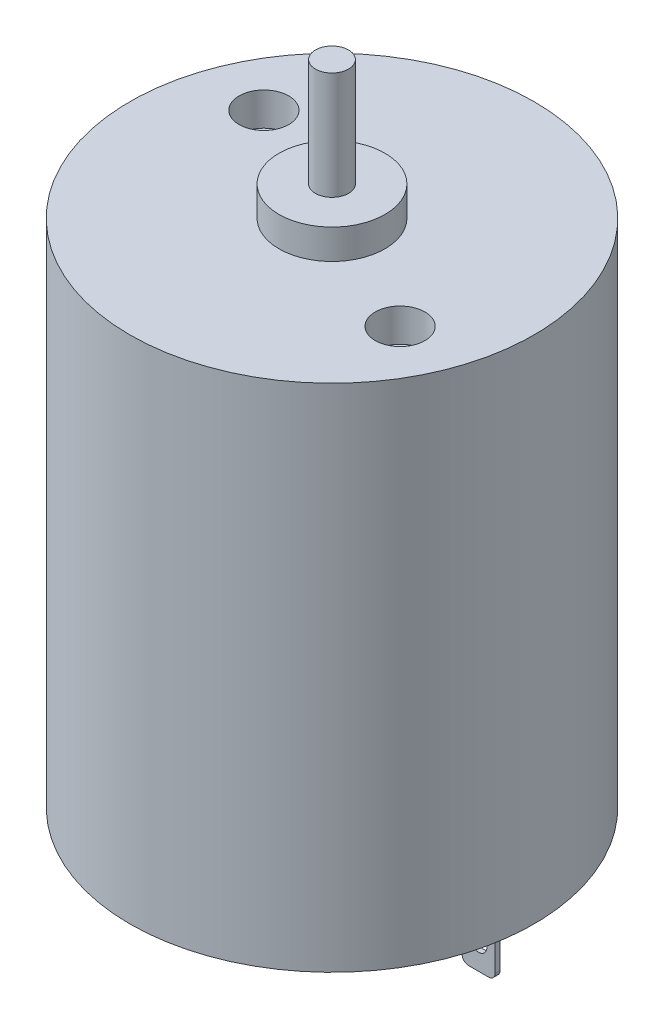
ISO-10303-21;
HEADER;
FILE_DESCRIPTION(('STEP AP214'),'2;1');
FILE_NAME('part.step','',(''),(''),'','','');
FILE_SCHEMA(('AUTOMOTIVE_DESIGN { 1 0 10303 214 1 1 1 1 }'));
ENDSEC;
DATA;
#1=APPLICATION_CONTEXT('core data for automotive mechanical design processes');
#2=APPLICATION_PROTOCOL_DEFINITION('international standard','automotive_design',2000,#1);
#3=PRODUCT_CONTEXT('',#1,'mechanical');
#4=PRODUCT('Part','Part','',(#3));
#5=PRODUCT_RELATED_PRODUCT_CATEGORY('part','',(#4));
#6=PRODUCT_DEFINITION_FORMATION('','',#4);
#7=PRODUCT_DEFINITION_CONTEXT('part definition',#1,'design');
#8=PRODUCT_DEFINITION('design','',#6,#7);
#9=PRODUCT_DEFINITION_SHAPE('','',#8);
#10=(LENGTH_UNIT() NAMED_UNIT(*) SI_UNIT(.MILLI.,.METRE.));
#11=(NAMED_UNIT(*) PLANE_ANGLE_UNIT() SI_UNIT($,.RADIAN.));
#12=(NAMED_UNIT(*) SI_UNIT($,.STERADIAN.) SOLID_ANGLE_UNIT());
#13=UNCERTAINTY_MEASURE_WITH_UNIT(LENGTH_MEASURE(1.E-05),#10,'distance_accuracy_value','');
#14=(GEOMETRIC_REPRESENTATION_CONTEXT(3) GLOBAL_UNCERTAINTY_ASSIGNED_CONTEXT((#13)) GLOBAL_UNIT_ASSIGNED_CONTEXT((#10,
#11,#12)) REPRESENTATION_CONTEXT('',''));
#15=CARTESIAN_POINT('',(0.,0.,0.));
#16=DIRECTION('',(0.,0.,1.));
#17=DIRECTION('',(1.,0.,0.));
#18=AXIS2_PLACEMENT_3D('',#15,#16,#17);
#19=CARTESIAN_POINT('',(0.,0.,0.));
#20=DIRECTION('',(0.,1.,0.));
#21=DIRECTION('',(0.,0.,1.));
#22=AXIS2_PLACEMENT_3D('',#19,#20,#21);
#23=PLANE('',#22);
#24=DIRECTION('',(1.,0.,0.));
#25=VECTOR('',#24,1.);
#26=CARTESIAN_POINT('',(-10.,0.,-0.150000000000002));
#27=LINE('',#26,#25);
#28=CARTESIAN_POINT('',(-10.,0.,-0.150000000000002));
#29=VERTEX_POINT('',#28);
#30=CARTESIAN_POINT('',(-8.,0.,-0.150000000000002));
#31=VERTEX_POINT('',#30);
#32=EDGE_CURVE('E140',#29,#31,#27,.T.);
#33=ORIENTED_EDGE('',*,*,#32,.F.);
#34=DIRECTION('',(0.,0.,1.));
#35=VECTOR('',#34,1.);
#36=CARTESIAN_POINT('',(-10.,0.,-0.150000000000002));
#37=LINE('',#36,#35);
#38=CARTESIAN_POINT('',(-10.,0.,0.149999999999997));
#39=VERTEX_POINT('',#38);
#40=EDGE_CURVE('E144',#29,#39,#37,.T.);
#41=ORIENTED_EDGE('',*,*,#40,.T.);
#42=DIRECTION('',(-1.,0.,0.));
#43=VECTOR('',#42,1.);
#44=CARTESIAN_POINT('',(-8.,0.,0.149999999999998));
#45=LINE('',#44,#43);
#46=CARTESIAN_POINT('',(-8.,0.,0.149999999999998));
#47=VERTEX_POINT('',#46);
#48=EDGE_CURVE('E153',#47,#39,#45,.T.);
#49=ORIENTED_EDGE('',*,*,#48,.F.);
#50=DIRECTION('',(0.,0.,1.));
#51=VECTOR('',#50,1.);
#52=CARTESIAN_POINT('',(-8.,0.,-0.150000000000002));
#53=LINE('',#52,#51);
#54=EDGE_CURVE('E157',#31,#47,#53,.T.);
#55=ORIENTED_EDGE('',*,*,#54,.F.);
#56=EDGE_LOOP('',(#33,#41,#49,#55));
#57=FACE_BOUND('',#56,.T.);
#58=CARTESIAN_POINT('',(0.,0.,0.));
#59=DIRECTION('',(0.,1.,0.));
#60=DIRECTION('',(0.,0.,1.));
#61=AXIS2_PLACEMENT_3D('',#58,#59,#60);
#62=CIRCLE('',#61,12.2);
#63=CARTESIAN_POINT('',(0.,0.,-12.2));
#64=VERTEX_POINT('',#63);
#65=EDGE_CURVE('E232',#64,#64,#62,.T.);
#66=ORIENTED_EDGE('',*,*,#65,.F.);
#67=EDGE_LOOP('',(#66));
#68=FACE_BOUND('',#67,.T.);
#69=DIRECTION('',(0.,0.,1.));
#70=VECTOR('',#69,1.);
#71=CARTESIAN_POINT('',(10.,0.,-0.150000000000002));
#72=LINE('',#71,#70);
#73=CARTESIAN_POINT('',(10.,0.,-0.150000000000002));
#74=VERTEX_POINT('',#73);
#75=CARTESIAN_POINT('',(10.,0.,0.149999999999997));
#76=VERTEX_POINT('',#75);
#77=EDGE_CURVE('E194',#74,#76,#72,.T.);
#78=ORIENTED_EDGE('',*,*,#77,.F.);
#79=DIRECTION('',(-1.,0.,0.));
#80=VECTOR('',#79,1.);
#81=CARTESIAN_POINT('',(10.,0.,-0.150000000000002));
#82=LINE('',#81,#80);
#83=CARTESIAN_POINT('',(8.,0.,-0.150000000000002));
#84=VERTEX_POINT('',#83);
#85=EDGE_CURVE('E182',#74,#84,#82,.T.);
#86=ORIENTED_EDGE('',*,*,#85,.T.);
#87=DIRECTION('',(0.,0.,1.));
#88=VECTOR('',#87,1.);
#89=CARTESIAN_POINT('',(8.,0.,-0.150000000000002));
#90=LINE('',#89,#88);
#91=CARTESIAN_POINT('',(8.,0.,0.149999999999998));
#92=VERTEX_POINT('',#91);
#93=EDGE_CURVE('E186',#84,#92,#90,.T.);
#94=ORIENTED_EDGE('',*,*,#93,.T.);
#95=DIRECTION('',(1.,0.,0.));
#96=VECTOR('',#95,1.);
#97=CARTESIAN_POINT('',(8.,0.,0.149999999999998));
#98=LINE('',#97,#96);
#99=EDGE_CURVE('E190',#92,#76,#98,.T.);
#100=ORIENTED_EDGE('',*,*,#99,.T.);
#101=EDGE_LOOP('',(#78,#86,#94,#100));
#102=FACE_BOUND('',#101,.T.);
#103=CARTESIAN_POINT('',(0.,0.,0.));
#104=DIRECTION('',(0.,-1.,0.));
#105=DIRECTION('',(0.,0.,-1.));
#106=AXIS2_PLACEMENT_3D('',#103,#104,#105);
#107=CIRCLE('',#106,3.2);
#108=CARTESIAN_POINT('',(0.,0.,-3.2));
#109=VERTEX_POINT('',#108);
#110=EDGE_CURVE('E199',#109,#109,#107,.T.);
#111=ORIENTED_EDGE('',*,*,#110,.F.);
#112=EDGE_LOOP('',(#111));
#113=FACE_BOUND('',#112,.T.);
#114=ADVANCED_FACE('F45',(#57,#68,#102,#113),#23,.F.);
#115=CARTESIAN_POINT('',(0.,30.8,0.));
#116=DIRECTION('',(0.,-1.,0.));
#117=DIRECTION('',(0.,0.,-1.));
#118=AXIS2_PLACEMENT_3D('',#115,#116,#117);
#119=CYLINDRICAL_SURFACE('',#118,12.2);
#120=CARTESIAN_POINT('',(0.,30.8,0.));
#121=DIRECTION('',(0.,1.,0.));
#122=DIRECTION('',(0.,0.,1.));
#123=AXIS2_PLACEMENT_3D('',#120,#121,#122);
#124=CIRCLE('',#123,12.2);
#125=CARTESIAN_POINT('',(0.,30.8,-12.2));
#126=VERTEX_POINT('',#125);
#127=EDGE_CURVE('E236',#126,#126,#124,.T.);
#128=CARTESIAN_POINT('',(0.,30.8,-12.2));
#129=CARTESIAN_POINT('',(0.,30.4791666666667,-12.2));
#130=CARTESIAN_POINT('',(0.,30.1583333333333,-12.2));
#131=CARTESIAN_POINT('',(0.,29.5166666666667,-12.2));
#132=CARTESIAN_POINT('',(0.,29.1958333333333,-12.2));
#133=CARTESIAN_POINT('',(0.,28.5541666666667,-12.2));
#134=CARTESIAN_POINT('',(0.,28.2333333333333,-12.2));
#135=CARTESIAN_POINT('',(0.,27.5916666666667,-12.2));
#136=CARTESIAN_POINT('',(0.,27.2708333333333,-12.2));
#137=CARTESIAN_POINT('',(0.,26.6291666666667,-12.2));
#138=CARTESIAN_POINT('',(0.,26.3083333333333,-12.2));
#139=CARTESIAN_POINT('',(0.,25.6666666666667,-12.2));
#140=CARTESIAN_POINT('',(0.,25.3458333333333,-12.2));
#141=CARTESIAN_POINT('',(0.,24.7041666666667,-12.2));
#142=CARTESIAN_POINT('',(0.,24.3833333333333,-12.2));
#143=CARTESIAN_POINT('',(0.,23.7416666666667,-12.2));
#144=CARTESIAN_POINT('',(0.,23.4208333333333,-12.2));
#145=CARTESIAN_POINT('',(0.,22.7791666666667,-12.2));
#146=CARTESIAN_POINT('',(0.,22.4583333333333,-12.2));
#147=CARTESIAN_POINT('',(0.,21.8166666666667,-12.2));
#148=CARTESIAN_POINT('',(0.,21.4958333333333,-12.2));
#149=CARTESIAN_POINT('',(0.,20.8541666666667,-12.2));
#150=CARTESIAN_POINT('',(0.,20.5333333333333,-12.2));
#151=CARTESIAN_POINT('',(0.,19.8916666666667,-12.2));
#152=CARTESIAN_POINT('',(0.,19.5708333333333,-12.2));
#153=CARTESIAN_POINT('',(0.,18.9291666666667,-12.2));
#154=CARTESIAN_POINT('',(0.,18.6083333333333,-12.2));
#155=CARTESIAN_POINT('',(0.,17.9666666666667,-12.2));
#156=CARTESIAN_POINT('',(0.,17.6458333333333,-12.2));
#157=CARTESIAN_POINT('',(0.,17.0041666666667,-12.2));
#158=CARTESIAN_POINT('',(0.,16.6833333333333,-12.2));
#159=CARTESIAN_POINT('',(0.,16.0416666666667,-12.2));
#160=CARTESIAN_POINT('',(0.,15.7208333333333,-12.2));
#161=CARTESIAN_POINT('',(0.,15.0791666666667,-12.2));
#162=CARTESIAN_POINT('',(0.,14.7583333333333,-12.2));
#163=CARTESIAN_POINT('',(0.,14.1166666666667,-12.2));
#164=CARTESIAN_POINT('',(0.,13.7958333333333,-12.2));
#165=CARTESIAN_POINT('',(0.,13.1541666666667,-12.2));
#166=CARTESIAN_POINT('',(0.,12.8333333333333,-12.2));
#167=CARTESIAN_POINT('',(0.,12.1916666666667,-12.2));
#168=CARTESIAN_POINT('',(0.,11.8708333333333,-12.2));
#169=CARTESIAN_POINT('',(0.,11.2291666666667,-12.2));
#170=CARTESIAN_POINT('',(0.,10.9083333333333,-12.2));
#171=CARTESIAN_POINT('',(0.,10.2666666666667,-12.2));
#172=CARTESIAN_POINT('',(0.,9.94583333333333,-12.2));
#173=CARTESIAN_POINT('',(0.,9.30416666666667,-12.2));
#174=CARTESIAN_POINT('',(0.,8.98333333333333,-12.2));
#175=CARTESIAN_POINT('',(0.,8.34166666666667,-12.2));
#176=CARTESIAN_POINT('',(0.,8.02083333333333,-12.2));
#177=CARTESIAN_POINT('',(0.,7.37916666666666,-12.2));
#178=CARTESIAN_POINT('',(0.,7.05833333333333,-12.2));
#179=CARTESIAN_POINT('',(0.,6.41666666666666,-12.2));
#180=CARTESIAN_POINT('',(0.,6.09583333333333,-12.2));
#181=CARTESIAN_POINT('',(0.,5.45416666666667,-12.2));
#182=CARTESIAN_POINT('',(0.,5.13333333333333,-12.2));
#183=CARTESIAN_POINT('',(0.,4.49166666666666,-12.2));
#184=CARTESIAN_POINT('',(0.,4.17083333333333,-12.2));
#185=CARTESIAN_POINT('',(0.,3.52916666666666,-12.2));
#186=CARTESIAN_POINT('',(0.,3.20833333333333,-12.2));
#187=CARTESIAN_POINT('',(0.,2.56666666666666,-12.2));
#188=CARTESIAN_POINT('',(0.,2.24583333333333,-12.2));
#189=CARTESIAN_POINT('',(0.,1.60416666666666,-12.2));
#190=CARTESIAN_POINT('',(0.,1.28333333333333,-12.2));
#191=CARTESIAN_POINT('',(0.,0.641666666666664,-12.2));
#192=CARTESIAN_POINT('',(0.,0.32083333333333,-12.2));
#193=CARTESIAN_POINT('',(0.,0.,-12.2));
#194=B_SPLINE_CURVE_WITH_KNOTS('',3,(#128,#129,#130,#131,#132,#133,#134,#135,#136,#137,#138,
#139,#140,#141,#142,#143,#144,#145,#146,#147,#148,#149,#150,#151,#152,#153,#154,#155,#156,#157,
#158,#159,#160,#161,#162,#163,#164,#165,#166,#167,#168,#169,#170,#171,#172,#173,#174,#175,#176,
#177,#178,#179,#180,#181,#182,#183,#184,#185,#186,#187,#188,#189,#190,#191,#192,#193),
.UNSPECIFIED.,.F.,.F.,(4,2,2,2,2,2,2,2,2,2,2,2,2,2,2,2,2,2,2,2,2,2,2,2,2,2,2,2,2,2,2,2,4),(0.,
0.962500000000002,1.925,2.8875,3.85,4.8125,5.775,6.7375,7.7,8.6625,9.625,10.5875,11.55,12.5125,
13.475,14.4375,15.4,16.3625,17.325,18.2875,19.25,20.2125,21.175,22.1375,23.1,24.0625,25.025,
25.9875,26.95,27.9125,28.875,29.8375,30.8),.UNSPECIFIED.);
#195=EDGE_CURVE('BSEAM309',#126,#64,#194,.T.);
#196=ORIENTED_EDGE('',*,*,#127,.F.);
#197=ORIENTED_EDGE('',*,*,#65,.T.);
#198=ORIENTED_EDGE('',*,*,#195,.T.);
#199=ORIENTED_EDGE('',*,*,#195,.F.);
#200=EDGE_LOOP('',(#196,#198,#197,#199));
#201=FACE_BOUND('',#200,.T.);
#202=ADVANCED_FACE('F309',(#201),#119,.T.);
#203=CARTESIAN_POINT('',(0.,30.8,0.));
#204=DIRECTION('',(0.,1.,0.));
#205=DIRECTION('',(0.,0.,1.));
#206=AXIS2_PLACEMENT_3D('',#203,#204,#205);
#207=PLANE('',#206);
#208=CARTESIAN_POINT('',(7.70361618981155,30.8,3.5922552247959));
#209=DIRECTION('',(0.,1.,0.));
#210=DIRECTION('',(0.,0.,1.));
#211=AXIS2_PLACEMENT_3D('',#208,#209,#210);
#212=CIRCLE('',#211,1.5);
#213=CARTESIAN_POINT('',(7.70361618981155,30.8,5.0922552247959));
#214=VERTEX_POINT('',#213);
#215=EDGE_CURVE('E210',#214,#214,#212,.T.);
#216=ORIENTED_EDGE('',*,*,#215,.F.);
#217=EDGE_LOOP('',(#216));
#218=FACE_BOUND('',#217,.T.);
#219=CARTESIAN_POINT('',(-7.70361618981155,30.8,-3.5922552247959));
#220=DIRECTION('',(0.,1.,0.));
#221=DIRECTION('',(0.,0.,1.));
#222=AXIS2_PLACEMENT_3D('',#219,#220,#221);
#223=CIRCLE('',#222,1.5);
#224=CARTESIAN_POINT('',(-7.70361618981155,30.8,-2.09225522479589));
#225=VERTEX_POINT('',#224);
#226=EDGE_CURVE('E214',#225,#225,#223,.T.);
#227=ORIENTED_EDGE('',*,*,#226,.F.);
#228=EDGE_LOOP('',(#227));
#229=FACE_BOUND('',#228,.T.);
#230=CARTESIAN_POINT('',(0.,30.8,0.));
#231=DIRECTION('',(0.,1.,0.));
#232=DIRECTION('',(0.,0.,1.));
#233=AXIS2_PLACEMENT_3D('',#230,#231,#232);
#234=CIRCLE('',#233,3.2);
#235=CARTESIAN_POINT('',(0.,30.8,3.2));
#236=VERTEX_POINT('',#235);
#237=EDGE_CURVE('E228',#236,#236,#234,.T.);
#238=ORIENTED_EDGE('',*,*,#237,.F.);
#239=EDGE_LOOP('',(#238));
#240=FACE_BOUND('',#239,.T.);
#241=ORIENTED_EDGE('',*,*,#127,.T.);
#242=EDGE_LOOP('',(#241));
#243=FACE_BOUND('',#242,.T.);
#244=ADVANCED_FACE('F316',(#218,#229,#240,#243),#207,.T.);
#245=CARTESIAN_POINT('',(0.,32.6,0.));
#246=DIRECTION('',(0.,-1.,0.));
#247=DIRECTION('',(0.,0.,-1.));
#248=AXIS2_PLACEMENT_3D('',#245,#246,#247);
#249=CYLINDRICAL_SURFACE('',#248,3.2);
#250=CARTESIAN_POINT('',(0.,32.6,0.));
#251=DIRECTION('',(0.,1.,0.));
#252=DIRECTION('',(0.,0.,1.));
#253=AXIS2_PLACEMENT_3D('',#250,#251,#252);
#254=CIRCLE('',#253,3.2);
#255=CARTESIAN_POINT('',(0.,32.6,3.2));
#256=VERTEX_POINT('',#255);
#257=EDGE_CURVE('E224',#256,#256,#254,.T.);
#258=ORIENTED_EDGE('',*,*,#257,.F.);
#259=EDGE_LOOP('',(#258));
#260=FACE_BOUND('',#259,.T.);
#261=ORIENTED_EDGE('',*,*,#237,.T.);
#262=EDGE_LOOP('',(#261));
#263=FACE_BOUND('',#262,.T.);
#264=ADVANCED_FACE('F454',(#260,#263),#249,.T.);
#265=CARTESIAN_POINT('',(0.,32.6,0.));
#266=DIRECTION('',(0.,1.,0.));
#267=DIRECTION('',(0.,0.,1.));
#268=AXIS2_PLACEMENT_3D('',#265,#266,#267);
#269=PLANE('',#268);
#270=CARTESIAN_POINT('',(0.,32.6,0.));
#271=DIRECTION('',(0.,1.,0.));
#272=DIRECTION('',(0.,0.,1.));
#273=AXIS2_PLACEMENT_3D('',#270,#271,#272);
#274=CIRCLE('',#273,1.);
#275=CARTESIAN_POINT('',(0.,32.6,-1.));
#276=VERTEX_POINT('',#275);
#277=EDGE_CURVE('E204',#276,#276,#274,.T.);
#278=ORIENTED_EDGE('',*,*,#277,.F.);
#279=EDGE_LOOP('',(#278));
#280=FACE_BOUND('',#279,.T.);
#281=ORIENTED_EDGE('',*,*,#257,.T.);
#282=EDGE_LOOP('',(#281));
#283=FACE_BOUND('',#282,.T.);
#284=ADVANCED_FACE('F451',(#280,#283),#269,.T.);
#285=CARTESIAN_POINT('',(0.,39.1,0.));
#286=DIRECTION('',(0.,-1.,0.));
#287=DIRECTION('',(0.,0.,-1.));
#288=AXIS2_PLACEMENT_3D('',#285,#286,#287);
#289=CYLINDRICAL_SURFACE('',#288,1.);
#290=CARTESIAN_POINT('',(0.,39.1,0.));
#291=DIRECTION('',(0.,1.,0.));
#292=DIRECTION('',(0.,0.,1.));
#293=AXIS2_PLACEMENT_3D('',#290,#291,#292);
#294=CIRCLE('',#293,1.);
#295=CARTESIAN_POINT('',(0.,39.1,-1.));
#296=VERTEX_POINT('',#295);
#297=EDGE_CURVE('E209',#296,#296,#294,.T.);
#298=CARTESIAN_POINT('',(0.,39.1,-1.));
#299=CARTESIAN_POINT('',(0.,39.0322916666667,-1.));
#300=CARTESIAN_POINT('',(0.,38.9645833333333,-1.));
#301=CARTESIAN_POINT('',(0.,38.8291666666667,-1.));
#302=CARTESIAN_POINT('',(0.,38.7614583333333,-1.));
#303=CARTESIAN_POINT('',(0.,38.6260416666667,-1.));
#304=CARTESIAN_POINT('',(0.,38.5583333333333,-1.));
#305=CARTESIAN_POINT('',(0.,38.4229166666667,-1.));
#306=CARTESIAN_POINT('',(0.,38.3552083333333,-1.));
#307=CARTESIAN_POINT('',(0.,38.2197916666667,-1.));
#308=CARTESIAN_POINT('',(0.,38.1520833333333,-1.));
#309=CARTESIAN_POINT('',(0.,38.0166666666667,-1.));
#310=CARTESIAN_POINT('',(0.,37.9489583333333,-1.));
#311=CARTESIAN_POINT('',(0.,37.8135416666667,-1.));
#312=CARTESIAN_POINT('',(0.,37.7458333333333,-1.));
#313=CARTESIAN_POINT('',(0.,37.6104166666667,-1.));
#314=CARTESIAN_POINT('',(0.,37.5427083333333,-1.));
#315=CARTESIAN_POINT('',(0.,37.4072916666667,-1.));
#316=CARTESIAN_POINT('',(0.,37.3395833333333,-1.));
#317=CARTESIAN_POINT('',(0.,37.2041666666667,-1.));
#318=CARTESIAN_POINT('',(0.,37.1364583333333,-1.));
#319=CARTESIAN_POINT('',(0.,37.0010416666667,-1.));
#320=CARTESIAN_POINT('',(0.,36.9333333333333,-1.));
#321=CARTESIAN_POINT('',(0.,36.7979166666667,-1.));
#322=CARTESIAN_POINT('',(0.,36.7302083333333,-1.));
#323=CARTESIAN_POINT('',(0.,36.5947916666667,-1.));
#324=CARTESIAN_POINT('',(0.,36.5270833333333,-1.));
#325=CARTESIAN_POINT('',(0.,36.3916666666667,-1.));
#326=CARTESIAN_POINT('',(0.,36.3239583333333,-1.));
#327=CARTESIAN_POINT('',(0.,36.1885416666667,-1.));
#328=CARTESIAN_POINT('',(0.,36.1208333333333,-1.));
#329=CARTESIAN_POINT('',(0.,35.9854166666667,-1.));
#330=CARTESIAN_POINT('',(0.,35.9177083333333,-1.));
#331=CARTESIAN_POINT('',(0.,35.7822916666667,-1.));
#332=CARTESIAN_POINT('',(0.,35.7145833333333,-1.));
#333=CARTESIAN_POINT('',(0.,35.5791666666667,-1.));
#334=CARTESIAN_POINT('',(0.,35.5114583333333,-1.));
#335=CARTESIAN_POINT('',(0.,35.3760416666667,-1.));
#336=CARTESIAN_POINT('',(0.,35.3083333333333,-1.));
#337=CARTESIAN_POINT('',(0.,35.1729166666667,-1.));
#338=CARTESIAN_POINT('',(0.,35.1052083333333,-1.));
#339=CARTESIAN_POINT('',(0.,34.9697916666667,-1.));
#340=CARTESIAN_POINT('',(0.,34.9020833333333,-1.));
#341=CARTESIAN_POINT('',(0.,34.7666666666667,-1.));
#342=CARTESIAN_POINT('',(0.,34.6989583333333,-1.));
#343=CARTESIAN_POINT('',(0.,34.5635416666667,-1.));
#344=CARTESIAN_POINT('',(0.,34.4958333333333,-1.));
#345=CARTESIAN_POINT('',(0.,34.3604166666667,-1.));
#346=CARTESIAN_POINT('',(0.,34.2927083333333,-1.));
#347=CARTESIAN_POINT('',(0.,34.1572916666667,-1.));
#348=CARTESIAN_POINT('',(0.,34.0895833333333,-1.));
#349=CARTESIAN_POINT('',(0.,33.9541666666667,-1.));
#350=CARTESIAN_POINT('',(0.,33.8864583333333,-1.));
#351=CARTESIAN_POINT('',(0.,33.7510416666667,-1.));
#352=CARTESIAN_POINT('',(0.,33.6833333333333,-1.));
#353=CARTESIAN_POINT('',(0.,33.5479166666667,-1.));
#354=CARTESIAN_POINT('',(0.,33.4802083333333,-1.));
#355=CARTESIAN_POINT('',(0.,33.3447916666667,-1.));
#356=CARTESIAN_POINT('',(0.,33.2770833333333,-1.));
#357=CARTESIAN_POINT('',(0.,33.1416666666667,-1.));
#358=CARTESIAN_POINT('',(0.,33.0739583333333,-1.));
#359=CARTESIAN_POINT('',(0.,32.9385416666667,-1.));
#360=CARTESIAN_POINT('',(0.,32.8708333333333,-1.));
#361=CARTESIAN_POINT('',(0.,32.7354166666667,-1.));
#362=CARTESIAN_POINT('',(0.,32.6677083333333,-1.));
#363=CARTESIAN_POINT('',(0.,32.6,-1.));
#364=B_SPLINE_CURVE_WITH_KNOTS('',3,(#298,#299,#300,#301,#302,#303,#304,#305,#306,#307,#308,
#309,#310,#311,#312,#313,#314,#315,#316,#317,#318,#319,#320,#321,#322,#323,#324,#325,#326,#327,
#328,#329,#330,#331,#332,#333,#334,#335,#336,#337,#338,#339,#340,#341,#342,#343,#344,#345,#346,
#347,#348,#349,#350,#351,#352,#353,#354,#355,#356,#357,#358,#359,#360,#361,#362,#363),
.UNSPECIFIED.,.F.,.F.,(4,2,2,2,2,2,2,2,2,2,2,2,2,2,2,2,2,2,2,2,2,2,2,2,2,2,2,2,2,2,2,2,4),(0.,
0.203124999999998,0.406249999999997,0.609374999999995,0.812499999999994,1.015625,1.21875,
1.421875,1.62499999999999,1.828125,2.03125,2.234375,2.4375,2.64062499999999,2.84375,3.046875,
3.25,3.45312499999999,3.65625,3.859375,4.0625,4.26562499999999,4.46874999999999,4.671875,4.875,
5.078125,5.28124999999999,5.484375,5.6875,5.890625,6.09374999999999,6.29687499999999,6.5),.UNSPECIFIED.);
#365=EDGE_CURVE('BSEAM447',#296,#276,#364,.T.);
#366=ORIENTED_EDGE('',*,*,#297,.F.);
#367=ORIENTED_EDGE('',*,*,#277,.T.);
#368=ORIENTED_EDGE('',*,*,#365,.T.);
#369=ORIENTED_EDGE('',*,*,#365,.F.);
#370=EDGE_LOOP('',(#366,#368,#367,#369));
#371=FACE_BOUND('',#370,.T.);
#372=ADVANCED_FACE('F447',(#371),#289,.T.);
#373=CARTESIAN_POINT('',(0.,39.1,0.));
#374=DIRECTION('',(0.,1.,0.));
#375=DIRECTION('',(0.,0.,1.));
#376=AXIS2_PLACEMENT_3D('',#373,#374,#375);
#377=PLANE('',#376);
#378=ORIENTED_EDGE('',*,*,#297,.T.);
#379=EDGE_LOOP('',(#378));
#380=FACE_BOUND('',#379,.T.);
#381=ADVANCED_FACE('F440',(#380),#377,.T.);
#382=CARTESIAN_POINT('',(-7.70361618981155,28.8,-3.5922552247959));
#383=DIRECTION('',(0.,1.,0.));
#384=DIRECTION('',(0.,0.,1.));
#385=AXIS2_PLACEMENT_3D('',#382,#383,#384);
#386=CYLINDRICAL_SURFACE('',#385,1.5);
#387=CARTESIAN_POINT('',(-7.70361618981155,28.8,-3.5922552247959));
#388=DIRECTION('',(0.,1.,0.));
#389=DIRECTION('',(0.,0.,1.));
#390=AXIS2_PLACEMENT_3D('',#387,#388,#389);
#391=CIRCLE('',#390,1.5);
#392=CARTESIAN_POINT('',(-7.70361618981155,28.8,-2.09225522479589));
#393=VERTEX_POINT('',#392);
#394=EDGE_CURVE('E164',#393,#393,#391,.T.);
#395=ORIENTED_EDGE('',*,*,#394,.F.);
#396=EDGE_LOOP('',(#395));
#397=FACE_BOUND('',#396,.T.);
#398=ORIENTED_EDGE('',*,*,#226,.T.);
#399=EDGE_LOOP('',(#398));
#400=FACE_BOUND('',#399,.T.);
#401=ADVANCED_FACE('F437',(#397,#400),#386,.F.);
#402=CARTESIAN_POINT('',(-7.70361618981155,28.8,-3.5922552247959));
#403=DIRECTION('',(0.,1.,0.));
#404=DIRECTION('',(0.,0.,1.));
#405=AXIS2_PLACEMENT_3D('',#402,#403,#404);
#406=PLANE('',#405);
#407=ORIENTED_EDGE('',*,*,#394,.T.);
#408=EDGE_LOOP('',(#407));
#409=FACE_BOUND('',#408,.T.);
#410=ADVANCED_FACE('F435',(#409),#406,.T.);
#411=CARTESIAN_POINT('',(7.70361618981155,28.8,3.5922552247959));
#412=DIRECTION('',(0.,1.,0.));
#413=DIRECTION('',(0.,0.,1.));
#414=AXIS2_PLACEMENT_3D('',#411,#412,#413);
#415=CYLINDRICAL_SURFACE('',#414,1.5);
#416=CARTESIAN_POINT('',(7.70361618981155,28.8,3.5922552247959));
#417=DIRECTION('',(0.,1.,0.));
#418=DIRECTION('',(0.,0.,1.));
#419=AXIS2_PLACEMENT_3D('',#416,#417,#418);
#420=CIRCLE('',#419,1.5);
#421=CARTESIAN_POINT('',(7.70361618981155,28.8,5.0922552247959));
#422=VERTEX_POINT('',#421);
#423=EDGE_CURVE('E205',#422,#422,#420,.T.);
#424=ORIENTED_EDGE('',*,*,#423,.F.);
#425=EDGE_LOOP('',(#424));
#426=FACE_BOUND('',#425,.T.);
#427=ORIENTED_EDGE('',*,*,#215,.T.);
#428=EDGE_LOOP('',(#427));
#429=FACE_BOUND('',#428,.T.);
#430=ADVANCED_FACE('F400',(#426,#429),#415,.F.);
#431=CARTESIAN_POINT('',(7.70361618981155,28.8,3.5922552247959));
#432=DIRECTION('',(0.,1.,0.));
#433=DIRECTION('',(0.,0.,1.));
#434=AXIS2_PLACEMENT_3D('',#431,#432,#433);
#435=PLANE('',#434);
#436=ORIENTED_EDGE('',*,*,#423,.T.);
#437=EDGE_LOOP('',(#436));
#438=FACE_BOUND('',#437,.T.);
#439=ADVANCED_FACE('F394',(#438),#435,.T.);
#440=CARTESIAN_POINT('',(-10.,-1.6,-0.150000000000002));
#441=DIRECTION('',(0.,0.,1.));
#442=DIRECTION('',(1.,0.,0.));
#443=AXIS2_PLACEMENT_3D('',#440,#441,#442);
#444=PLANE('',#443);
#445=CARTESIAN_POINT('',(-9.,-2.5,-0.150000000000002));
#446=DIRECTION('',(0.,0.,-1.));
#447=DIRECTION('',(-1.,0.,0.));
#448=AXIS2_PLACEMENT_3D('',#445,#446,#447);
#449=CIRCLE('',#448,0.500000000000001);
#450=CARTESIAN_POINT('',(-9.5,-2.5,-0.150000000000002));
#451=VERTEX_POINT('',#450);
#452=EDGE_CURVE('E380',#451,#451,#449,.T.);
#453=ORIENTED_EDGE('',*,*,#452,.F.);
#454=EDGE_LOOP('',(#453));
#455=FACE_BOUND('',#454,.T.);
#456=DIRECTION('',(1.,0.,0.));
#457=VECTOR('',#456,1.);
#458=CARTESIAN_POINT('',(-10.,-4.,-0.150000000000002));
#459=LINE('',#458,#457);
#460=CARTESIAN_POINT('',(-9.6,-4.,-0.150000000000002));
#461=VERTEX_POINT('',#460);
#462=CARTESIAN_POINT('',(-8.4,-4.,-0.150000000000002));
#463=VERTEX_POINT('',#462);
#464=EDGE_CURVE('E295',#461,#463,#459,.T.);
#465=ORIENTED_EDGE('',*,*,#464,.F.);
#466=CARTESIAN_POINT('',(-9.6,-3.6,-0.150000000000002));
#467=DIRECTION('',(0.,0.,1.));
#468=DIRECTION('',(1.,0.,0.));
#469=AXIS2_PLACEMENT_3D('',#466,#467,#468);
#470=CIRCLE('',#469,0.4);
#471=CARTESIAN_POINT('',(-10.,-3.6,-0.150000000000002));
#472=VERTEX_POINT('',#471);
#473=EDGE_CURVE('E142',#461,#472,#470,.F.);
#474=ORIENTED_EDGE('',*,*,#473,.T.);
#475=DIRECTION('',(0.,1.,0.));
#476=VECTOR('',#475,1.);
#477=CARTESIAN_POINT('',(-10.,-1.6,-0.150000000000002));
#478=LINE('',#477,#476);
#479=EDGE_CURVE('E134',#472,#29,#478,.T.);
#480=ORIENTED_EDGE('',*,*,#479,.T.);
#481=ORIENTED_EDGE('',*,*,#32,.T.);
#482=DIRECTION('',(0.,1.,0.));
#483=VECTOR('',#482,1.);
#484=CARTESIAN_POINT('',(-8.,-1.6,-0.150000000000002));
#485=LINE('',#484,#483);
#486=CARTESIAN_POINT('',(-8.,-3.6,-0.150000000000002));
#487=VERTEX_POINT('',#486);
#488=EDGE_CURVE('E197',#487,#31,#485,.T.);
#489=ORIENTED_EDGE('',*,*,#488,.F.);
#490=CARTESIAN_POINT('',(-8.4,-3.6,-0.150000000000002));
#491=DIRECTION('',(0.,0.,1.));
#492=DIRECTION('',(1.,0.,0.));
#493=AXIS2_PLACEMENT_3D('',#490,#491,#492);
#494=CIRCLE('',#493,0.4);
#495=EDGE_CURVE('E276',#487,#463,#494,.F.);
#496=ORIENTED_EDGE('',*,*,#495,.T.);
#497=EDGE_LOOP('',(#465,#474,#480,#481,#489,#496));
#498=FACE_BOUND('',#497,.T.);
#499=ADVANCED_FACE('F137',(#455,#498),#444,.F.);
#500=CARTESIAN_POINT('',(-8.,-1.6,-0.150000000000002));
#501=DIRECTION('',(-1.,0.,0.));
#502=DIRECTION('',(0.,0.,1.));
#503=AXIS2_PLACEMENT_3D('',#500,#501,#502);
#504=PLANE('',#503);
#505=DIRECTION('',(0.,1.,0.));
#506=VECTOR('',#505,1.);
#507=CARTESIAN_POINT('',(-8.,-1.6,0.149999999999998));
#508=LINE('',#507,#506);
#509=CARTESIAN_POINT('',(-8.,-3.6,0.149999999999998));
#510=VERTEX_POINT('',#509);
#511=EDGE_CURVE('E361',#510,#47,#508,.T.);
#512=ORIENTED_EDGE('',*,*,#511,.F.);
#513=DIRECTION('',(0.,0.,1.));
#514=VECTOR('',#513,1.);
#515=CARTESIAN_POINT('',(-8.,-3.6,-0.150000000000002));
#516=LINE('',#515,#514);
#517=EDGE_CURVE('E11',#510,#487,#516,.F.);
#518=ORIENTED_EDGE('',*,*,#517,.T.);
#519=ORIENTED_EDGE('',*,*,#488,.T.);
#520=ORIENTED_EDGE('',*,*,#54,.T.);
#521=EDGE_LOOP('',(#512,#518,#519,#520));
#522=FACE_BOUND('',#521,.T.);
#523=ADVANCED_FACE('F368',(#522),#504,.F.);
#524=CARTESIAN_POINT('',(-8.,-1.6,0.149999999999998));
#525=DIRECTION('',(0.,0.,-1.));
#526=DIRECTION('',(-1.,0.,0.));
#527=AXIS2_PLACEMENT_3D('',#524,#525,#526);
#528=PLANE('',#527);
#529=CARTESIAN_POINT('',(-9.,-2.5,0.150000000000002));
#530=DIRECTION('',(0.,0.,1.));
#531=DIRECTION('',(1.,0.,0.));
#532=AXIS2_PLACEMENT_3D('',#529,#530,#531);
#533=CIRCLE('',#532,0.500000000000001);
#534=CARTESIAN_POINT('',(-8.5,-2.5,0.150000000000002));
#535=VERTEX_POINT('',#534);
#536=EDGE_CURVE('E374',#535,#535,#533,.F.);
#537=ORIENTED_EDGE('',*,*,#536,.T.);
#538=EDGE_LOOP('',(#537));
#539=FACE_BOUND('',#538,.T.);
#540=DIRECTION('',(0.,1.,0.));
#541=VECTOR('',#540,1.);
#542=CARTESIAN_POINT('',(-10.,-1.6,0.149999999999997));
#543=LINE('',#542,#541);
#544=CARTESIAN_POINT('',(-10.,-3.6,0.149999999999997));
#545=VERTEX_POINT('',#544);
#546=EDGE_CURVE('E145',#545,#39,#543,.T.);
#547=ORIENTED_EDGE('',*,*,#546,.F.);
#548=CARTESIAN_POINT('',(-9.6,-3.6,0.149999999999997));
#549=DIRECTION('',(0.,0.,-1.));
#550=DIRECTION('',(-1.,0.,0.));
#551=AXIS2_PLACEMENT_3D('',#548,#549,#550);
#552=CIRCLE('',#551,0.4);
#553=CARTESIAN_POINT('',(-9.6,-4.,0.149999999999997));
#554=VERTEX_POINT('',#553);
#555=EDGE_CURVE('E54',#545,#554,#552,.F.);
#556=ORIENTED_EDGE('',*,*,#555,.T.);
#557=DIRECTION('',(-1.,0.,0.));
#558=VECTOR('',#557,1.);
#559=CARTESIAN_POINT('',(-8.,-4.,0.149999999999998));
#560=LINE('',#559,#558);
#561=CARTESIAN_POINT('',(-8.4,-4.,0.149999999999997));
#562=VERTEX_POINT('',#561);
#563=EDGE_CURVE('E173',#562,#554,#560,.T.);
#564=ORIENTED_EDGE('',*,*,#563,.F.);
#565=CARTESIAN_POINT('',(-8.4,-3.6,0.149999999999997));
#566=DIRECTION('',(0.,0.,-1.));
#567=DIRECTION('',(-1.,0.,0.));
#568=AXIS2_PLACEMENT_3D('',#565,#566,#567);
#569=CIRCLE('',#568,0.4);
#570=EDGE_CURVE('E61',#562,#510,#569,.F.);
#571=ORIENTED_EDGE('',*,*,#570,.T.);
#572=ORIENTED_EDGE('',*,*,#511,.T.);
#573=ORIENTED_EDGE('',*,*,#48,.T.);
#574=EDGE_LOOP('',(#547,#556,#564,#571,#572,#573));
#575=FACE_BOUND('',#574,.T.);
#576=ADVANCED_FACE('F287',(#539,#575),#528,.F.);
#577=CARTESIAN_POINT('',(-10.,-1.6,-0.150000000000002));
#578=DIRECTION('',(-1.,0.,0.));
#579=DIRECTION('',(0.,0.,1.));
#580=AXIS2_PLACEMENT_3D('',#577,#578,#579);
#581=PLANE('',#580);
#582=ORIENTED_EDGE('',*,*,#479,.F.);
#583=DIRECTION('',(0.,0.,-1.));
#584=VECTOR('',#583,1.);
#585=CARTESIAN_POINT('',(-10.,-3.6,-0.150000000000002));
#586=LINE('',#585,#584);
#587=EDGE_CURVE('E69',#472,#545,#586,.F.);
#588=ORIENTED_EDGE('',*,*,#587,.T.);
#589=ORIENTED_EDGE('',*,*,#546,.T.);
#590=ORIENTED_EDGE('',*,*,#40,.F.);
#591=EDGE_LOOP('',(#582,#588,#589,#590));
#592=FACE_BOUND('',#591,.T.);
#593=ADVANCED_FACE('F148',(#592),#581,.T.);
#594=CARTESIAN_POINT('',(10.,-1.6,-0.150000000000002));
#595=DIRECTION('',(-1.,0.,0.));
#596=DIRECTION('',(0.,0.,1.));
#597=AXIS2_PLACEMENT_3D('',#594,#595,#596);
#598=PLANE('',#597);
#599=DIRECTION('',(0.,1.,0.));
#600=VECTOR('',#599,1.);
#601=CARTESIAN_POINT('',(10.,-1.6,0.149999999999997));
#602=LINE('',#601,#600);
#603=CARTESIAN_POINT('',(10.,-3.6,0.149999999999997));
#604=VERTEX_POINT('',#603);
#605=EDGE_CURVE('E169',#604,#76,#602,.T.);
#606=ORIENTED_EDGE('',*,*,#605,.F.);
#607=DIRECTION('',(0.,0.,1.));
#608=VECTOR('',#607,1.);
#609=CARTESIAN_POINT('',(10.,-3.6,-0.150000000000002));
#610=LINE('',#609,#608);
#611=CARTESIAN_POINT('',(10.,-3.6,-0.150000000000002));
#612=VERTEX_POINT('',#611);
#613=EDGE_CURVE('E265',#604,#612,#610,.F.);
#614=ORIENTED_EDGE('',*,*,#613,.T.);
#615=DIRECTION('',(0.,1.,0.));
#616=VECTOR('',#615,1.);
#617=CARTESIAN_POINT('',(10.,-1.6,-0.150000000000002));
#618=LINE('',#617,#616);
#619=EDGE_CURVE('E179',#612,#74,#618,.T.);
#620=ORIENTED_EDGE('',*,*,#619,.T.);
#621=ORIENTED_EDGE('',*,*,#77,.T.);
#622=EDGE_LOOP('',(#606,#614,#620,#621));
#623=FACE_BOUND('',#622,.T.);
#624=ADVANCED_FACE('F411',(#623),#598,.F.);
#625=CARTESIAN_POINT('',(8.,-1.6,0.149999999999998));
#626=DIRECTION('',(0.,0.,1.));
#627=DIRECTION('',(1.,0.,0.));
#628=AXIS2_PLACEMENT_3D('',#625,#626,#627);
#629=PLANE('',#628);
#630=CARTESIAN_POINT('',(9.,-2.5,0.149999999999997));
#631=DIRECTION('',(0.,0.,1.));
#632=DIRECTION('',(1.,0.,0.));
#633=AXIS2_PLACEMENT_3D('',#630,#631,#632);
#634=CIRCLE('',#633,0.500000000000001);
#635=CARTESIAN_POINT('',(9.5,-2.5,0.149999999999997));
#636=VERTEX_POINT('',#635);
#637=EDGE_CURVE('E381',#636,#636,#634,.F.);
#638=ORIENTED_EDGE('',*,*,#637,.T.);
#639=EDGE_LOOP('',(#638));
#640=FACE_BOUND('',#639,.T.);
#641=DIRECTION('',(0.,1.,0.));
#642=VECTOR('',#641,1.);
#643=CARTESIAN_POINT('',(8.,-1.6,0.149999999999998));
#644=LINE('',#643,#642);
#645=CARTESIAN_POINT('',(8.,-3.6,0.149999999999998));
#646=VERTEX_POINT('',#645);
#647=EDGE_CURVE('E172',#646,#92,#644,.T.);
#648=ORIENTED_EDGE('',*,*,#647,.F.);
#649=CARTESIAN_POINT('',(8.4,-3.6,0.149999999999997));
#650=DIRECTION('',(0.,0.,1.));
#651=DIRECTION('',(1.,0.,0.));
#652=AXIS2_PLACEMENT_3D('',#649,#650,#651);
#653=CIRCLE('',#652,0.4);
#654=CARTESIAN_POINT('',(8.4,-4.,0.149999999999997));
#655=VERTEX_POINT('',#654);
#656=EDGE_CURVE('E262',#646,#655,#653,.T.);
#657=ORIENTED_EDGE('',*,*,#656,.T.);
#658=DIRECTION('',(-1.,0.,0.));
#659=VECTOR('',#658,1.);
#660=CARTESIAN_POINT('',(10.,-4.,0.149999999999997));
#661=LINE('',#660,#659);
#662=CARTESIAN_POINT('',(9.6,-4.,0.149999999999997));
#663=VERTEX_POINT('',#662);
#664=EDGE_CURVE('E340',#663,#655,#661,.T.);
#665=ORIENTED_EDGE('',*,*,#664,.F.);
#666=CARTESIAN_POINT('',(9.6,-3.6,0.149999999999997));
#667=DIRECTION('',(0.,0.,1.));
#668=DIRECTION('',(1.,0.,0.));
#669=AXIS2_PLACEMENT_3D('',#666,#667,#668);
#670=CIRCLE('',#669,0.4);
#671=EDGE_CURVE('E259',#663,#604,#670,.T.);
#672=ORIENTED_EDGE('',*,*,#671,.T.);
#673=ORIENTED_EDGE('',*,*,#605,.T.);
#674=ORIENTED_EDGE('',*,*,#99,.F.);
#675=EDGE_LOOP('',(#648,#657,#665,#672,#673,#674));
#676=FACE_BOUND('',#675,.T.);
#677=ADVANCED_FACE('F339',(#640,#676),#629,.T.);
#678=CARTESIAN_POINT('',(8.,-1.6,-0.150000000000002));
#679=DIRECTION('',(-1.,0.,0.));
#680=DIRECTION('',(0.,0.,1.));
#681=AXIS2_PLACEMENT_3D('',#678,#679,#680);
#682=PLANE('',#681);
#683=DIRECTION('',(0.,1.,0.));
#684=VECTOR('',#683,1.);
#685=CARTESIAN_POINT('',(8.,-1.6,-0.150000000000002));
#686=LINE('',#685,#684);
#687=CARTESIAN_POINT('',(8.,-3.6,-0.150000000000002));
#688=VERTEX_POINT('',#687);
#689=EDGE_CURVE('E176',#688,#84,#686,.T.);
#690=ORIENTED_EDGE('',*,*,#689,.F.);
#691=DIRECTION('',(0.,0.,-1.));
#692=VECTOR('',#691,1.);
#693=CARTESIAN_POINT('',(8.,-3.6,-0.150000000000002));
#694=LINE('',#693,#692);
#695=EDGE_CURVE('E256',#688,#646,#694,.F.);
#696=ORIENTED_EDGE('',*,*,#695,.T.);
#697=ORIENTED_EDGE('',*,*,#647,.T.);
#698=ORIENTED_EDGE('',*,*,#93,.F.);
#699=EDGE_LOOP('',(#690,#696,#697,#698));
#700=FACE_BOUND('',#699,.T.);
#701=ADVANCED_FACE('F417',(#700),#682,.T.);
#702=CARTESIAN_POINT('',(10.,-1.6,-0.150000000000002));
#703=DIRECTION('',(0.,0.,-1.));
#704=DIRECTION('',(-1.,0.,0.));
#705=AXIS2_PLACEMENT_3D('',#702,#703,#704);
#706=PLANE('',#705);
#707=CARTESIAN_POINT('',(9.,-2.5,-0.150000000000002));
#708=DIRECTION('',(0.,0.,-1.));
#709=DIRECTION('',(1.,0.,0.));
#710=AXIS2_PLACEMENT_3D('',#707,#708,#709);
#711=CIRCLE('',#710,0.500000000000001);
#712=CARTESIAN_POINT('',(9.5,-2.5,-0.150000000000002));
#713=VERTEX_POINT('',#712);
#714=EDGE_CURVE('E376',#713,#713,#711,.T.);
#715=ORIENTED_EDGE('',*,*,#714,.F.);
#716=EDGE_LOOP('',(#715));
#717=FACE_BOUND('',#716,.T.);
#718=DIRECTION('',(1.,0.,0.));
#719=VECTOR('',#718,1.);
#720=CARTESIAN_POINT('',(8.,-4.,-0.150000000000002));
#721=LINE('',#720,#719);
#722=CARTESIAN_POINT('',(8.4,-4.,-0.150000000000002));
#723=VERTEX_POINT('',#722);
#724=CARTESIAN_POINT('',(9.6,-4.,-0.150000000000002));
#725=VERTEX_POINT('',#724);
#726=EDGE_CURVE('E348',#723,#725,#721,.T.);
#727=ORIENTED_EDGE('',*,*,#726,.F.);
#728=CARTESIAN_POINT('',(8.4,-3.6,-0.150000000000002));
#729=DIRECTION('',(0.,0.,-1.));
#730=DIRECTION('',(-1.,0.,0.));
#731=AXIS2_PLACEMENT_3D('',#728,#729,#730);
#732=CIRCLE('',#731,0.4);
#733=EDGE_CURVE('E253',#723,#688,#732,.T.);
#734=ORIENTED_EDGE('',*,*,#733,.T.);
#735=ORIENTED_EDGE('',*,*,#689,.T.);
#736=ORIENTED_EDGE('',*,*,#85,.F.);
#737=ORIENTED_EDGE('',*,*,#619,.F.);
#738=CARTESIAN_POINT('',(9.6,-3.6,-0.150000000000002));
#739=DIRECTION('',(0.,0.,-1.));
#740=DIRECTION('',(-1.,0.,0.));
#741=AXIS2_PLACEMENT_3D('',#738,#739,#740);
#742=CIRCLE('',#741,0.4);
#743=EDGE_CURVE('E250',#612,#725,#742,.T.);
#744=ORIENTED_EDGE('',*,*,#743,.T.);
#745=EDGE_LOOP('',(#727,#734,#735,#736,#737,#744));
#746=FACE_BOUND('',#745,.T.);
#747=ADVANCED_FACE('F421',(#717,#746),#706,.T.);
#748=CARTESIAN_POINT('',(0.,-1.6,0.));
#749=DIRECTION('',(0.,1.,0.));
#750=DIRECTION('',(0.,0.,1.));
#751=AXIS2_PLACEMENT_3D('',#748,#749,#750);
#752=CYLINDRICAL_SURFACE('',#751,3.2);
#753=CARTESIAN_POINT('',(0.,-1.6,0.));
#754=DIRECTION('',(0.,-1.,0.));
#755=DIRECTION('',(0.,0.,-1.));
#756=AXIS2_PLACEMENT_3D('',#753,#754,#755);
#757=CIRCLE('',#756,3.2);
#758=CARTESIAN_POINT('',(0.,-1.6,-3.2));
#759=VERTEX_POINT('',#758);
#760=EDGE_CURVE('E159',#759,#759,#757,.T.);
#761=ORIENTED_EDGE('',*,*,#760,.F.);
#762=EDGE_LOOP('',(#761));
#763=FACE_BOUND('',#762,.T.);
#764=ORIENTED_EDGE('',*,*,#110,.T.);
#765=EDGE_LOOP('',(#764));
#766=FACE_BOUND('',#765,.T.);
#767=ADVANCED_FACE('F425',(#763,#766),#752,.T.);
#768=CARTESIAN_POINT('',(0.,-1.6,0.));
#769=DIRECTION('',(0.,-1.,0.));
#770=DIRECTION('',(0.,0.,-1.));
#771=AXIS2_PLACEMENT_3D('',#768,#769,#770);
#772=PLANE('',#771);
#773=CARTESIAN_POINT('',(0.,-1.6,0.));
#774=DIRECTION('',(0.,-1.,0.));
#775=DIRECTION('',(0.,0.,-1.));
#776=AXIS2_PLACEMENT_3D('',#773,#774,#775);
#777=CIRCLE('',#776,1.);
#778=CARTESIAN_POINT('',(0.,-1.6,-1.));
#779=VERTEX_POINT('',#778);
#780=EDGE_CURVE('E355',#779,#779,#777,.T.);
#781=ORIENTED_EDGE('',*,*,#780,.F.);
#782=EDGE_LOOP('',(#781));
#783=FACE_BOUND('',#782,.T.);
#784=ORIENTED_EDGE('',*,*,#760,.T.);
#785=EDGE_LOOP('',(#784));
#786=FACE_BOUND('',#785,.T.);
#787=ADVANCED_FACE('F427',(#783,#786),#772,.T.);
#788=CARTESIAN_POINT('',(0.,-4.,0.));
#789=DIRECTION('',(0.,-1.,0.));
#790=DIRECTION('',(0.,0.,-1.));
#791=AXIS2_PLACEMENT_3D('',#788,#789,#790);
#792=PLANE('',#791);
#793=ORIENTED_EDGE('',*,*,#664,.T.);
#794=DIRECTION('',(0.,0.,-1.));
#795=VECTOR('',#794,1.);
#796=CARTESIAN_POINT('',(8.4,-4.,0.));
#797=LINE('',#796,#795);
#798=EDGE_CURVE('E246',#655,#723,#797,.T.);
#799=ORIENTED_EDGE('',*,*,#798,.T.);
#800=ORIENTED_EDGE('',*,*,#726,.T.);
#801=DIRECTION('',(0.,0.,1.));
#802=VECTOR('',#801,1.);
#803=CARTESIAN_POINT('',(9.6,-4.,0.149999999999997));
#804=LINE('',#803,#802);
#805=EDGE_CURVE('E203',#725,#663,#804,.T.);
#806=ORIENTED_EDGE('',*,*,#805,.T.);
#807=EDGE_LOOP('',(#793,#799,#800,#806));
#808=FACE_BOUND('',#807,.T.);
#809=ADVANCED_FACE('F343',(#808),#792,.T.);
#810=CARTESIAN_POINT('',(0.,-4.,0.));
#811=DIRECTION('',(0.,-1.,0.));
#812=DIRECTION('',(0.,0.,-1.));
#813=AXIS2_PLACEMENT_3D('',#810,#811,#812);
#814=PLANE('',#813);
#815=ORIENTED_EDGE('',*,*,#563,.T.);
#816=DIRECTION('',(0.,0.,-1.));
#817=VECTOR('',#816,1.);
#818=CARTESIAN_POINT('',(-9.6,-4.,0.));
#819=LINE('',#818,#817);
#820=EDGE_CURVE('E272',#554,#461,#819,.T.);
#821=ORIENTED_EDGE('',*,*,#820,.T.);
#822=ORIENTED_EDGE('',*,*,#464,.T.);
#823=DIRECTION('',(0.,0.,1.));
#824=VECTOR('',#823,1.);
#825=CARTESIAN_POINT('',(-8.4,-4.,0.149999999999998));
#826=LINE('',#825,#824);
#827=EDGE_CURVE('E268',#463,#562,#826,.T.);
#828=ORIENTED_EDGE('',*,*,#827,.T.);
#829=EDGE_LOOP('',(#815,#821,#822,#828));
#830=FACE_BOUND('',#829,.T.);
#831=ADVANCED_FACE('F291',(#830),#814,.T.);
#832=CARTESIAN_POINT('',(0.,0.4,0.));
#833=DIRECTION('',(0.,-1.,0.));
#834=DIRECTION('',(0.,0.,-1.));
#835=AXIS2_PLACEMENT_3D('',#832,#833,#834);
#836=CYLINDRICAL_SURFACE('',#835,1.);
#837=CARTESIAN_POINT('',(0.,0.4,0.));
#838=DIRECTION('',(0.,-1.,0.));
#839=DIRECTION('',(0.,0.,-1.));
#840=AXIS2_PLACEMENT_3D('',#837,#838,#839);
#841=CIRCLE('',#840,1.);
#842=CARTESIAN_POINT('',(0.,0.4,-1.));
#843=VERTEX_POINT('',#842);
#844=EDGE_CURVE('E349',#843,#843,#841,.T.);
#845=ORIENTED_EDGE('',*,*,#844,.F.);
#846=EDGE_LOOP('',(#845));
#847=FACE_BOUND('',#846,.T.);
#848=ORIENTED_EDGE('',*,*,#780,.T.);
#849=EDGE_LOOP('',(#848));
#850=FACE_BOUND('',#849,.T.);
#851=ADVANCED_FACE('F600',(#847,#850),#836,.F.);
#852=CARTESIAN_POINT('',(0.,0.4,0.));
#853=DIRECTION('',(0.,-1.,0.));
#854=DIRECTION('',(0.,0.,-1.));
#855=AXIS2_PLACEMENT_3D('',#852,#853,#854);
#856=PLANE('',#855);
#857=ORIENTED_EDGE('',*,*,#844,.T.);
#858=EDGE_LOOP('',(#857));
#859=FACE_BOUND('',#858,.T.);
#860=ADVANCED_FACE('F604',(#859),#856,.T.);
#861=CARTESIAN_POINT('',(9.,-2.5,1.5642135623731));
#862=DIRECTION('',(0.,0.,-1.));
#863=DIRECTION('',(-1.,0.,0.));
#864=AXIS2_PLACEMENT_3D('',#861,#862,#863);
#865=CYLINDRICAL_SURFACE('',#864,0.500000000000001);
#866=ORIENTED_EDGE('',*,*,#714,.T.);
#867=EDGE_LOOP('',(#866));
#868=FACE_BOUND('',#867,.T.);
#869=ORIENTED_EDGE('',*,*,#637,.F.);
#870=EDGE_LOOP('',(#869));
#871=FACE_BOUND('',#870,.T.);
#872=ADVANCED_FACE('F329',(#868,#871),#865,.F.);
#873=CARTESIAN_POINT('',(-9.,-2.5,1.5642135623731));
#874=DIRECTION('',(0.,0.,-1.));
#875=DIRECTION('',(-1.,0.,0.));
#876=AXIS2_PLACEMENT_3D('',#873,#874,#875);
#877=CYLINDRICAL_SURFACE('',#876,0.500000000000001);
#878=ORIENTED_EDGE('',*,*,#452,.T.);
#879=EDGE_LOOP('',(#878));
#880=FACE_BOUND('',#879,.T.);
#881=ORIENTED_EDGE('',*,*,#536,.F.);
#882=EDGE_LOOP('',(#881));
#883=FACE_BOUND('',#882,.T.);
#884=ADVANCED_FACE('F323',(#880,#883),#877,.F.);
#885=CARTESIAN_POINT('',(8.4,-3.6,0.));
#886=DIRECTION('',(0.,0.,-1.));
#887=DIRECTION('',(-1.,0.,0.));
#888=AXIS2_PLACEMENT_3D('',#885,#886,#887);
#889=CYLINDRICAL_SURFACE('',#888,0.4);
#890=ORIENTED_EDGE('',*,*,#656,.F.);
#891=ORIENTED_EDGE('',*,*,#695,.F.);
#892=ORIENTED_EDGE('',*,*,#733,.F.);
#893=ORIENTED_EDGE('',*,*,#798,.F.);
#894=EDGE_LOOP('',(#890,#891,#892,#893));
#895=FACE_BOUND('',#894,.T.);
#896=ADVANCED_FACE('F305',(#895),#889,.T.);
#897=CARTESIAN_POINT('',(9.6,-3.6,0.));
#898=DIRECTION('',(0.,0.,-1.));
#899=DIRECTION('',(-1.,0.,0.));
#900=AXIS2_PLACEMENT_3D('',#897,#898,#899);
#901=CYLINDRICAL_SURFACE('',#900,0.4);
#902=ORIENTED_EDGE('',*,*,#743,.F.);
#903=ORIENTED_EDGE('',*,*,#613,.F.);
#904=ORIENTED_EDGE('',*,*,#671,.F.);
#905=ORIENTED_EDGE('',*,*,#805,.F.);
#906=EDGE_LOOP('',(#902,#903,#904,#905));
#907=FACE_BOUND('',#906,.T.);
#908=ADVANCED_FACE('F299',(#907),#901,.T.);
#909=CARTESIAN_POINT('',(-9.6,-3.6,0.));
#910=DIRECTION('',(0.,0.,-1.));
#911=DIRECTION('',(-1.,0.,0.));
#912=AXIS2_PLACEMENT_3D('',#909,#910,#911);
#913=CYLINDRICAL_SURFACE('',#912,0.4);
#914=ORIENTED_EDGE('',*,*,#555,.F.);
#915=ORIENTED_EDGE('',*,*,#587,.F.);
#916=ORIENTED_EDGE('',*,*,#473,.F.);
#917=ORIENTED_EDGE('',*,*,#820,.F.);
#918=EDGE_LOOP('',(#914,#915,#916,#917));
#919=FACE_BOUND('',#918,.T.);
#920=ADVANCED_FACE('F297',(#919),#913,.T.);
#921=CARTESIAN_POINT('',(-8.4,-3.6,0.));
#922=DIRECTION('',(0.,0.,-1.));
#923=DIRECTION('',(-1.,0.,0.));
#924=AXIS2_PLACEMENT_3D('',#921,#922,#923);
#925=CYLINDRICAL_SURFACE('',#924,0.4);
#926=ORIENTED_EDGE('',*,*,#495,.F.);
#927=ORIENTED_EDGE('',*,*,#517,.F.);
#928=ORIENTED_EDGE('',*,*,#570,.F.);
#929=ORIENTED_EDGE('',*,*,#827,.F.);
#930=EDGE_LOOP('',(#926,#927,#928,#929));
#931=FACE_BOUND('',#930,.T.);
#932=ADVANCED_FACE('F47',(#931),#925,.T.);
#933=CLOSED_SHELL('',(#114,#202,#244,#264,#284,#372,#381,#401,#410,#430,#439,#499,#523,#576,
#593,#624,#677,#701,#747,#767,#787,#809,#831,#851,#860,#872,#884,#896,#908,#920,#932));
#934=MANIFOLD_SOLID_BREP('B2',#933);
#935=ADVANCED_BREP_SHAPE_REPRESENTATION('',(#18,#934),#14);
#936=SHAPE_DEFINITION_REPRESENTATION(#9,#935);
ENDSEC;
END-ISO-10303-21;
